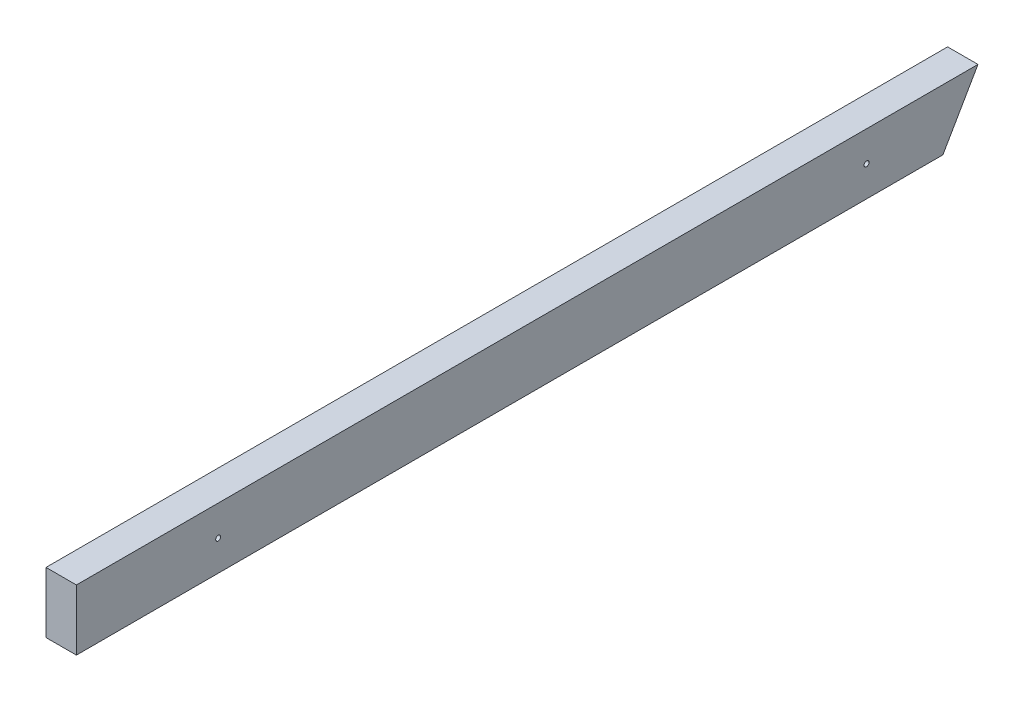
ISO-10303-21;
HEADER;
FILE_DESCRIPTION(('STEP AP214'),'2;1');
FILE_NAME('part.step','',(''),(''),'','','');
FILE_SCHEMA(('AUTOMOTIVE_DESIGN { 1 0 10303 214 1 1 1 1 }'));
ENDSEC;
DATA;
#1=APPLICATION_CONTEXT('core data for automotive mechanical design processes');
#2=APPLICATION_PROTOCOL_DEFINITION('international standard','automotive_design',2000,#1);
#3=PRODUCT_CONTEXT('',#1,'mechanical');
#4=PRODUCT('Part','Part','',(#3));
#5=PRODUCT_RELATED_PRODUCT_CATEGORY('part','',(#4));
#6=PRODUCT_DEFINITION_FORMATION('','',#4);
#7=PRODUCT_DEFINITION_CONTEXT('part definition',#1,'design');
#8=PRODUCT_DEFINITION('design','',#6,#7);
#9=PRODUCT_DEFINITION_SHAPE('','',#8);
#10=(LENGTH_UNIT() NAMED_UNIT(*) SI_UNIT(.MILLI.,.METRE.));
#11=(NAMED_UNIT(*) PLANE_ANGLE_UNIT() SI_UNIT($,.RADIAN.));
#12=(NAMED_UNIT(*) SI_UNIT($,.STERADIAN.) SOLID_ANGLE_UNIT());
#13=UNCERTAINTY_MEASURE_WITH_UNIT(LENGTH_MEASURE(1.E-05),#10,'distance_accuracy_value','');
#14=(GEOMETRIC_REPRESENTATION_CONTEXT(3) GLOBAL_UNCERTAINTY_ASSIGNED_CONTEXT((#13)) GLOBAL_UNIT_ASSIGNED_CONTEXT((#10,
#11,#12)) REPRESENTATION_CONTEXT('',''));
#15=CARTESIAN_POINT('',(0.,0.,0.));
#16=DIRECTION('',(0.,0.,1.));
#17=DIRECTION('',(1.,0.,0.));
#18=AXIS2_PLACEMENT_3D('',#15,#16,#17);
#19=CARTESIAN_POINT('',(-587.375,0.,0.));
#20=DIRECTION('',(1.,0.,0.));
#21=DIRECTION('',(0.,0.,-1.));
#22=AXIS2_PLACEMENT_3D('',#19,#20,#21);
#23=PLANE('',#22);
#24=CARTESIAN_POINT('',(-587.375,19.05,533.4));
#25=DIRECTION('',(-1.,0.,0.));
#26=DIRECTION('',(0.,0.,1.));
#27=AXIS2_PLACEMENT_3D('',#24,#25,#26);
#28=CIRCLE('',#27,1.5875);
#29=CARTESIAN_POINT('',(-587.375,19.05,534.9875));
#30=VERTEX_POINT('',#29);
#31=EDGE_CURVE('E82',#30,#30,#28,.F.);
#32=ORIENTED_EDGE('',*,*,#31,.T.);
#33=EDGE_LOOP('',(#32));
#34=FACE_BOUND('',#33,.T.);
#35=CARTESIAN_POINT('',(-587.375,19.05,939.8));
#36=DIRECTION('',(-1.,0.,0.));
#37=DIRECTION('',(0.,0.,1.));
#38=AXIS2_PLACEMENT_3D('',#35,#36,#37);
#39=CIRCLE('',#38,1.5875);
#40=CARTESIAN_POINT('',(-587.375,19.05,941.3875));
#41=VERTEX_POINT('',#40);
#42=EDGE_CURVE('E19',#41,#41,#39,.F.);
#43=ORIENTED_EDGE('',*,*,#42,.T.);
#44=EDGE_LOOP('',(#43));
#45=FACE_BOUND('',#44,.T.);
#46=DIRECTION('',(0.,0.,-1.));
#47=VECTOR('',#46,1.);
#48=CARTESIAN_POINT('',(-587.375,0.,1028.7));
#49=LINE('',#48,#47);
#50=CARTESIAN_POINT('',(-587.375,0.,1028.7));
#51=VERTEX_POINT('',#50);
#52=CARTESIAN_POINT('',(-587.375,0.,485.547045256012));
#53=VERTEX_POINT('',#52);
#54=EDGE_CURVE('E54',#51,#53,#49,.T.);
#55=ORIENTED_EDGE('',*,*,#54,.F.);
#56=DIRECTION('',(0.,1.,0.));
#57=VECTOR('',#56,1.);
#58=CARTESIAN_POINT('',(-587.375,38.1,1028.7));
#59=LINE('',#58,#57);
#60=CARTESIAN_POINT('',(-587.375,38.1,1028.7));
#61=VERTEX_POINT('',#60);
#62=EDGE_CURVE('E59',#61,#51,#59,.F.);
#63=ORIENTED_EDGE('',*,*,#62,.F.);
#64=DIRECTION('',(0.,0.,1.));
#65=VECTOR('',#64,1.);
#66=CARTESIAN_POINT('',(-587.375,38.1,463.55));
#67=LINE('',#66,#65);
#68=CARTESIAN_POINT('',(-587.375,38.0999999999754,463.549999999957));
#69=VERTEX_POINT('',#68);
#70=EDGE_CURVE('E89',#69,#61,#67,.T.);
#71=ORIENTED_EDGE('',*,*,#70,.F.);
#72=DIRECTION('',(0.,0.866025403784429,-0.500000000000017));
#73=VECTOR('',#72,1.);
#74=CARTESIAN_POINT('',(-587.375,0.,485.547045256012));
#75=LINE('',#74,#73);
#76=EDGE_CURVE('E69',#53,#69,#75,.T.);
#77=ORIENTED_EDGE('',*,*,#76,.F.);
#78=EDGE_LOOP('',(#55,#63,#71,#77));
#79=FACE_BOUND('',#78,.T.);
#80=ADVANCED_FACE('F16',(#34,#45,#79),#23,.F.);
#81=CARTESIAN_POINT('',(-587.375,38.1,1028.7));
#82=DIRECTION('',(0.,0.,1.));
#83=DIRECTION('',(1.,0.,0.));
#84=AXIS2_PLACEMENT_3D('',#81,#82,#83);
#85=PLANE('',#84);
#86=DIRECTION('',(1.,0.,0.));
#87=VECTOR('',#86,1.);
#88=CARTESIAN_POINT('',(-587.375,38.1,1028.7));
#89=LINE('',#88,#87);
#90=CARTESIAN_POINT('',(-568.325,38.1,1028.7));
#91=VERTEX_POINT('',#90);
#92=EDGE_CURVE('E64',#61,#91,#89,.T.);
#93=ORIENTED_EDGE('',*,*,#92,.F.);
#94=ORIENTED_EDGE('',*,*,#62,.T.);
#95=DIRECTION('',(1.,0.,0.));
#96=VECTOR('',#95,1.);
#97=CARTESIAN_POINT('',(-587.375,0.,1028.7));
#98=LINE('',#97,#96);
#99=CARTESIAN_POINT('',(-568.325,0.,1028.7));
#100=VERTEX_POINT('',#99);
#101=EDGE_CURVE('E61',#100,#51,#98,.F.);
#102=ORIENTED_EDGE('',*,*,#101,.F.);
#103=DIRECTION('',(0.,1.,0.));
#104=VECTOR('',#103,1.);
#105=CARTESIAN_POINT('',(-568.325,0.,1028.7));
#106=LINE('',#105,#104);
#107=EDGE_CURVE('E84',#91,#100,#106,.F.);
#108=ORIENTED_EDGE('',*,*,#107,.F.);
#109=EDGE_LOOP('',(#93,#94,#102,#108));
#110=FACE_BOUND('',#109,.T.);
#111=ADVANCED_FACE('F60',(#110),#85,.T.);
#112=CARTESIAN_POINT('',(-587.375,0.,1028.7));
#113=DIRECTION('',(0.,-1.,0.));
#114=DIRECTION('',(0.,0.,-1.));
#115=AXIS2_PLACEMENT_3D('',#112,#113,#114);
#116=PLANE('',#115);
#117=ORIENTED_EDGE('',*,*,#101,.T.);
#118=ORIENTED_EDGE('',*,*,#54,.T.);
#119=DIRECTION('',(1.,0.,0.));
#120=VECTOR('',#119,1.);
#121=CARTESIAN_POINT('',(-587.375,0.,485.547045256012));
#122=LINE('',#121,#120);
#123=CARTESIAN_POINT('',(-568.325,0.,485.547045256012));
#124=VERTEX_POINT('',#123);
#125=EDGE_CURVE('E71',#124,#53,#122,.F.);
#126=ORIENTED_EDGE('',*,*,#125,.F.);
#127=DIRECTION('',(0.,0.,-1.));
#128=VECTOR('',#127,1.);
#129=CARTESIAN_POINT('',(-568.325,0.,0.));
#130=LINE('',#129,#128);
#131=EDGE_CURVE('E75',#100,#124,#130,.T.);
#132=ORIENTED_EDGE('',*,*,#131,.F.);
#133=EDGE_LOOP('',(#117,#118,#126,#132));
#134=FACE_BOUND('',#133,.T.);
#135=ADVANCED_FACE('F73',(#134),#116,.T.);
#136=CARTESIAN_POINT('',(-587.375,0.,485.547045256012));
#137=DIRECTION('',(0.,-0.500000000000017,-0.866025403784429));
#138=DIRECTION('',(0.,0.866025403784429,-0.500000000000017));
#139=AXIS2_PLACEMENT_3D('',#136,#137,#138);
#140=PLANE('',#139);
#141=ORIENTED_EDGE('',*,*,#125,.T.);
#142=ORIENTED_EDGE('',*,*,#76,.T.);
#143=DIRECTION('',(1.,0.,0.));
#144=VECTOR('',#143,1.);
#145=CARTESIAN_POINT('',(-587.375,38.1,463.55));
#146=LINE('',#145,#144);
#147=CARTESIAN_POINT('',(-568.325,38.0999999999754,463.549999999957));
#148=VERTEX_POINT('',#147);
#149=EDGE_CURVE('E34',#148,#69,#146,.F.);
#150=ORIENTED_EDGE('',*,*,#149,.F.);
#151=DIRECTION('',(0.,0.866025403785548,-0.499999999998079));
#152=VECTOR('',#151,1.);
#153=CARTESIAN_POINT('',(-568.325,0.,485.547045256012));
#154=LINE('',#153,#152);
#155=EDGE_CURVE('E100',#124,#148,#154,.T.);
#156=ORIENTED_EDGE('',*,*,#155,.F.);
#157=EDGE_LOOP('',(#141,#142,#150,#156));
#158=FACE_BOUND('',#157,.T.);
#159=ADVANCED_FACE('F98',(#158),#140,.T.);
#160=CARTESIAN_POINT('',(-587.375,38.1,463.55));
#161=DIRECTION('',(0.,1.,0.));
#162=DIRECTION('',(0.,0.,1.));
#163=AXIS2_PLACEMENT_3D('',#160,#161,#162);
#164=PLANE('',#163);
#165=ORIENTED_EDGE('',*,*,#149,.T.);
#166=ORIENTED_EDGE('',*,*,#70,.T.);
#167=ORIENTED_EDGE('',*,*,#92,.T.);
#168=DIRECTION('',(0.,0.,-1.));
#169=VECTOR('',#168,1.);
#170=CARTESIAN_POINT('',(-568.325,38.1,0.));
#171=LINE('',#170,#169);
#172=EDGE_CURVE('E81',#148,#91,#171,.F.);
#173=ORIENTED_EDGE('',*,*,#172,.F.);
#174=EDGE_LOOP('',(#165,#166,#167,#173));
#175=FACE_BOUND('',#174,.T.);
#176=ADVANCED_FACE('F106',(#175),#164,.T.);
#177=CARTESIAN_POINT('',(-587.375,19.05,939.8));
#178=DIRECTION('',(-1.,0.,0.));
#179=DIRECTION('',(0.,0.,1.));
#180=AXIS2_PLACEMENT_3D('',#177,#178,#179);
#181=CYLINDRICAL_SURFACE('',#180,1.5875);
#182=CARTESIAN_POINT('',(-568.325,19.05,939.8));
#183=DIRECTION('',(-1.,0.,0.));
#184=DIRECTION('',(0.,0.,1.));
#185=AXIS2_PLACEMENT_3D('',#182,#183,#184);
#186=CIRCLE('',#185,1.5875);
#187=CARTESIAN_POINT('',(-568.325,19.05,941.3875));
#188=VERTEX_POINT('',#187);
#189=EDGE_CURVE('E25',#188,#188,#186,.T.);
#190=ORIENTED_EDGE('',*,*,#189,.F.);
#191=EDGE_LOOP('',(#190));
#192=FACE_BOUND('',#191,.T.);
#193=ORIENTED_EDGE('',*,*,#42,.F.);
#194=EDGE_LOOP('',(#193));
#195=FACE_BOUND('',#194,.T.);
#196=ADVANCED_FACE('F108',(#192,#195),#181,.F.);
#197=CARTESIAN_POINT('',(-587.375,19.05,533.4));
#198=DIRECTION('',(-1.,0.,0.));
#199=DIRECTION('',(0.,0.,1.));
#200=AXIS2_PLACEMENT_3D('',#197,#198,#199);
#201=CYLINDRICAL_SURFACE('',#200,1.5875);
#202=CARTESIAN_POINT('',(-568.325,19.05,533.4));
#203=DIRECTION('',(-1.,0.,0.));
#204=DIRECTION('',(0.,0.,1.));
#205=AXIS2_PLACEMENT_3D('',#202,#203,#204);
#206=CIRCLE('',#205,1.5875);
#207=CARTESIAN_POINT('',(-568.325,19.05,534.9875));
#208=VERTEX_POINT('',#207);
#209=EDGE_CURVE('E11',#208,#208,#206,.T.);
#210=ORIENTED_EDGE('',*,*,#209,.F.);
#211=EDGE_LOOP('',(#210));
#212=FACE_BOUND('',#211,.T.);
#213=ORIENTED_EDGE('',*,*,#31,.F.);
#214=EDGE_LOOP('',(#213));
#215=FACE_BOUND('',#214,.T.);
#216=ADVANCED_FACE('F115',(#212,#215),#201,.F.);
#217=CARTESIAN_POINT('',(-568.325,0.,0.));
#218=DIRECTION('',(1.,0.,0.));
#219=DIRECTION('',(0.,0.,-1.));
#220=AXIS2_PLACEMENT_3D('',#217,#218,#219);
#221=PLANE('',#220);
#222=ORIENTED_EDGE('',*,*,#209,.T.);
#223=EDGE_LOOP('',(#222));
#224=FACE_BOUND('',#223,.T.);
#225=ORIENTED_EDGE('',*,*,#189,.T.);
#226=EDGE_LOOP('',(#225));
#227=FACE_BOUND('',#226,.T.);
#228=ORIENTED_EDGE('',*,*,#155,.T.);
#229=ORIENTED_EDGE('',*,*,#172,.T.);
#230=ORIENTED_EDGE('',*,*,#107,.T.);
#231=ORIENTED_EDGE('',*,*,#131,.T.);
#232=EDGE_LOOP('',(#228,#229,#230,#231));
#233=FACE_BOUND('',#232,.T.);
#234=ADVANCED_FACE('F104',(#224,#227,#233),#221,.T.);
#235=CLOSED_SHELL('',(#80,#111,#135,#159,#176,#196,#216,#234));
#236=MANIFOLD_SOLID_BREP('B1',#235);
#237=ADVANCED_BREP_SHAPE_REPRESENTATION('',(#18,#236),#14);
#238=SHAPE_DEFINITION_REPRESENTATION(#9,#237);
ENDSEC;
END-ISO-10303-21;
